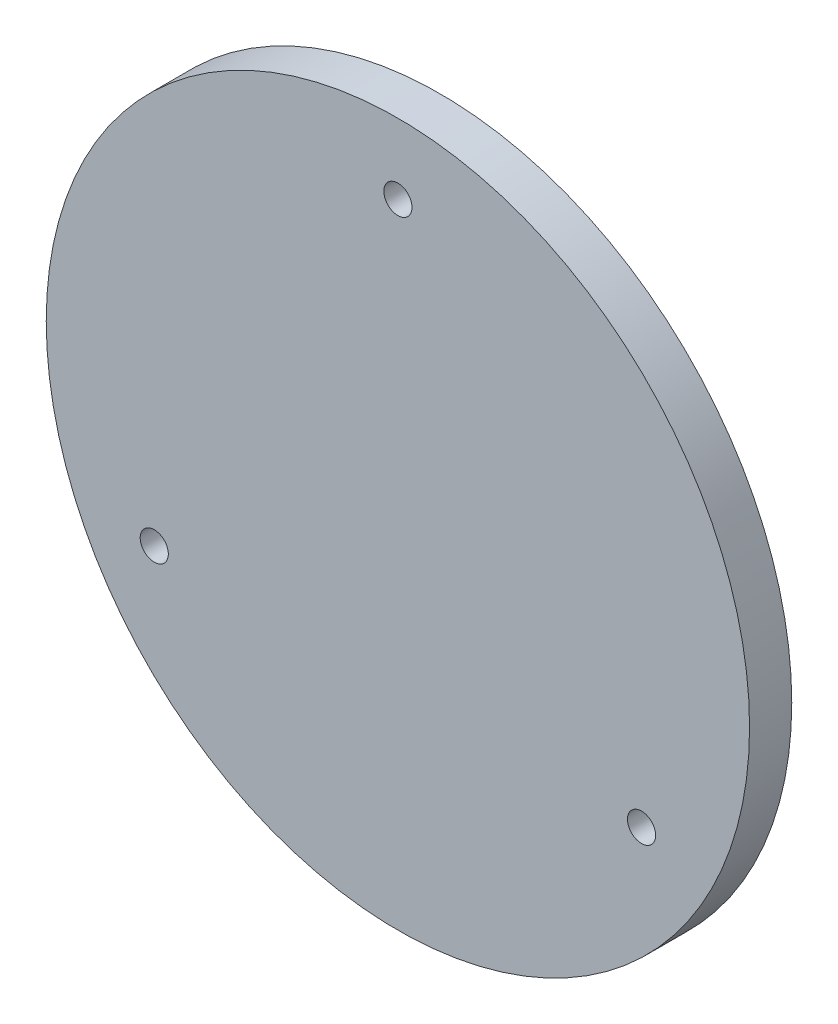
ISO-10303-21;
HEADER;
FILE_DESCRIPTION(('STEP AP214'),'2;1');
FILE_NAME('part.step','',(''),(''),'','','');
FILE_SCHEMA(('AUTOMOTIVE_DESIGN { 1 0 10303 214 1 1 1 1 }'));
ENDSEC;
DATA;
#1=APPLICATION_CONTEXT('core data for automotive mechanical design processes');
#2=APPLICATION_PROTOCOL_DEFINITION('international standard','automotive_design',2000,#1);
#3=PRODUCT_CONTEXT('',#1,'mechanical');
#4=PRODUCT('Part','Part','',(#3));
#5=PRODUCT_RELATED_PRODUCT_CATEGORY('part','',(#4));
#6=PRODUCT_DEFINITION_FORMATION('','',#4);
#7=PRODUCT_DEFINITION_CONTEXT('part definition',#1,'design');
#8=PRODUCT_DEFINITION('design','',#6,#7);
#9=PRODUCT_DEFINITION_SHAPE('','',#8);
#10=(LENGTH_UNIT() NAMED_UNIT(*) SI_UNIT(.MILLI.,.METRE.));
#11=(NAMED_UNIT(*) PLANE_ANGLE_UNIT() SI_UNIT($,.RADIAN.));
#12=(NAMED_UNIT(*) SI_UNIT($,.STERADIAN.) SOLID_ANGLE_UNIT());
#13=UNCERTAINTY_MEASURE_WITH_UNIT(LENGTH_MEASURE(1.E-05),#10,'distance_accuracy_value','');
#14=(GEOMETRIC_REPRESENTATION_CONTEXT(3) GLOBAL_UNCERTAINTY_ASSIGNED_CONTEXT((#13)) GLOBAL_UNIT_ASSIGNED_CONTEXT((#10,
#11,#12)) REPRESENTATION_CONTEXT('',''));
#15=CARTESIAN_POINT('',(0.,0.,0.));
#16=DIRECTION('',(0.,0.,1.));
#17=DIRECTION('',(1.,0.,0.));
#18=AXIS2_PLACEMENT_3D('',#15,#16,#17);
#19=CARTESIAN_POINT('',(0.,0.,3.));
#20=DIRECTION('',(0.,0.,1.));
#21=DIRECTION('',(1.,0.,0.));
#22=AXIS2_PLACEMENT_3D('',#19,#20,#21);
#23=PLANE('',#22);
#24=CARTESIAN_POINT('',(-17.3205080756887,-10.0000000000001,3.));
#25=DIRECTION('',(0.,0.,1.));
#26=DIRECTION('',(1.,0.,0.));
#27=AXIS2_PLACEMENT_3D('',#24,#25,#26);
#28=CIRCLE('',#27,1.);
#29=CARTESIAN_POINT('',(-16.3205080756887,-10.0000000000001,3.));
#30=VERTEX_POINT('',#29);
#31=EDGE_CURVE('E48',#30,#30,#28,.T.);
#32=ORIENTED_EDGE('',*,*,#31,.F.);
#33=EDGE_LOOP('',(#32));
#34=FACE_BOUND('',#33,.T.);
#35=CARTESIAN_POINT('',(0.,0.,3.));
#36=DIRECTION('',(0.,0.,1.));
#37=DIRECTION('',(1.,0.,0.));
#38=AXIS2_PLACEMENT_3D('',#35,#36,#37);
#39=CIRCLE('',#38,25.);
#40=CARTESIAN_POINT('',(25.,0.,3.));
#41=VERTEX_POINT('',#40);
#42=EDGE_CURVE('E10',#41,#41,#39,.T.);
#43=ORIENTED_EDGE('',*,*,#42,.T.);
#44=EDGE_LOOP('',(#43));
#45=FACE_BOUND('',#44,.T.);
#46=CARTESIAN_POINT('',(0.,20.,3.));
#47=DIRECTION('',(0.,0.,1.));
#48=DIRECTION('',(1.,0.,0.));
#49=AXIS2_PLACEMENT_3D('',#46,#47,#48);
#50=CIRCLE('',#49,1.);
#51=CARTESIAN_POINT('',(1.,20.,3.));
#52=VERTEX_POINT('',#51);
#53=EDGE_CURVE('E43',#52,#52,#50,.T.);
#54=ORIENTED_EDGE('',*,*,#53,.F.);
#55=EDGE_LOOP('',(#54));
#56=FACE_BOUND('',#55,.T.);
#57=CARTESIAN_POINT('',(17.3205080756887,-10.0000000000001,3.));
#58=DIRECTION('',(0.,0.,1.));
#59=DIRECTION('',(1.,0.,0.));
#60=AXIS2_PLACEMENT_3D('',#57,#58,#59);
#61=CIRCLE('',#60,1.);
#62=CARTESIAN_POINT('',(18.3205080756887,-10.0000000000001,3.));
#63=VERTEX_POINT('',#62);
#64=EDGE_CURVE('E54',#63,#63,#61,.T.);
#65=ORIENTED_EDGE('',*,*,#64,.F.);
#66=EDGE_LOOP('',(#65));
#67=FACE_BOUND('',#66,.T.);
#68=ADVANCED_FACE('F32',(#34,#45,#56,#67),#23,.T.);
#69=CARTESIAN_POINT('',(0.,0.,0.));
#70=DIRECTION('',(0.,0.,1.));
#71=DIRECTION('',(1.,0.,0.));
#72=AXIS2_PLACEMENT_3D('',#69,#70,#71);
#73=PLANE('',#72);
#74=CARTESIAN_POINT('',(0.,0.,0.));
#75=DIRECTION('',(0.,0.,1.));
#76=DIRECTION('',(1.,0.,0.));
#77=AXIS2_PLACEMENT_3D('',#74,#75,#76);
#78=CIRCLE('',#77,25.);
#79=CARTESIAN_POINT('',(25.,0.,0.));
#80=VERTEX_POINT('',#79);
#81=EDGE_CURVE('E36',#80,#80,#78,.T.);
#82=ORIENTED_EDGE('',*,*,#81,.F.);
#83=EDGE_LOOP('',(#82));
#84=FACE_BOUND('',#83,.T.);
#85=CARTESIAN_POINT('',(0.,20.,0.));
#86=DIRECTION('',(0.,0.,1.));
#87=DIRECTION('',(1.,0.,0.));
#88=AXIS2_PLACEMENT_3D('',#85,#86,#87);
#89=CIRCLE('',#88,1.);
#90=CARTESIAN_POINT('',(1.,20.,0.));
#91=VERTEX_POINT('',#90);
#92=EDGE_CURVE('E45',#91,#91,#89,.T.);
#93=ORIENTED_EDGE('',*,*,#92,.T.);
#94=EDGE_LOOP('',(#93));
#95=FACE_BOUND('',#94,.T.);
#96=CARTESIAN_POINT('',(-17.3205080756887,-10.0000000000001,0.));
#97=DIRECTION('',(0.,0.,1.));
#98=DIRECTION('',(1.,0.,0.));
#99=AXIS2_PLACEMENT_3D('',#96,#97,#98);
#100=CIRCLE('',#99,1.);
#101=CARTESIAN_POINT('',(-16.3205080756887,-10.0000000000001,0.));
#102=VERTEX_POINT('',#101);
#103=EDGE_CURVE('E51',#102,#102,#100,.T.);
#104=ORIENTED_EDGE('',*,*,#103,.T.);
#105=EDGE_LOOP('',(#104));
#106=FACE_BOUND('',#105,.T.);
#107=CARTESIAN_POINT('',(17.3205080756887,-10.0000000000001,0.));
#108=DIRECTION('',(0.,0.,1.));
#109=DIRECTION('',(1.,0.,0.));
#110=AXIS2_PLACEMENT_3D('',#107,#108,#109);
#111=CIRCLE('',#110,1.);
#112=CARTESIAN_POINT('',(18.3205080756887,-10.0000000000001,0.));
#113=VERTEX_POINT('',#112);
#114=EDGE_CURVE('E57',#113,#113,#111,.T.);
#115=ORIENTED_EDGE('',*,*,#114,.T.);
#116=EDGE_LOOP('',(#115));
#117=FACE_BOUND('',#116,.T.);
#118=ADVANCED_FACE('F67',(#84,#95,#106,#117),#73,.F.);
#119=CARTESIAN_POINT('',(0.,0.,3.));
#120=DIRECTION('',(0.,0.,-1.));
#121=DIRECTION('',(-1.,0.,0.));
#122=AXIS2_PLACEMENT_3D('',#119,#120,#121);
#123=CYLINDRICAL_SURFACE('',#122,25.);
#124=ORIENTED_EDGE('',*,*,#42,.F.);
#125=EDGE_LOOP('',(#124));
#126=FACE_BOUND('',#125,.T.);
#127=ORIENTED_EDGE('',*,*,#81,.T.);
#128=EDGE_LOOP('',(#127));
#129=FACE_BOUND('',#128,.T.);
#130=ADVANCED_FACE('F34',(#126,#129),#123,.T.);
#131=CARTESIAN_POINT('',(0.,20.,3.));
#132=DIRECTION('',(0.,0.,-1.));
#133=DIRECTION('',(-1.,0.,0.));
#134=AXIS2_PLACEMENT_3D('',#131,#132,#133);
#135=CYLINDRICAL_SURFACE('',#134,1.);
#136=ORIENTED_EDGE('',*,*,#53,.T.);
#137=EDGE_LOOP('',(#136));
#138=FACE_BOUND('',#137,.T.);
#139=ORIENTED_EDGE('',*,*,#92,.F.);
#140=EDGE_LOOP('',(#139));
#141=FACE_BOUND('',#140,.T.);
#142=ADVANCED_FACE('F76',(#138,#141),#135,.F.);
#143=CARTESIAN_POINT('',(-17.3205080756887,-10.0000000000001,3.));
#144=DIRECTION('',(0.,0.,-1.));
#145=DIRECTION('',(-1.,0.,0.));
#146=AXIS2_PLACEMENT_3D('',#143,#144,#145);
#147=CYLINDRICAL_SURFACE('',#146,1.);
#148=ORIENTED_EDGE('',*,*,#31,.T.);
#149=EDGE_LOOP('',(#148));
#150=FACE_BOUND('',#149,.T.);
#151=ORIENTED_EDGE('',*,*,#103,.F.);
#152=EDGE_LOOP('',(#151));
#153=FACE_BOUND('',#152,.T.);
#154=ADVANCED_FACE('F79',(#150,#153),#147,.F.);
#155=CARTESIAN_POINT('',(17.3205080756887,-10.0000000000001,3.));
#156=DIRECTION('',(0.,0.,-1.));
#157=DIRECTION('',(-1.,0.,0.));
#158=AXIS2_PLACEMENT_3D('',#155,#156,#157);
#159=CYLINDRICAL_SURFACE('',#158,1.);
#160=ORIENTED_EDGE('',*,*,#64,.T.);
#161=EDGE_LOOP('',(#160));
#162=FACE_BOUND('',#161,.T.);
#163=ORIENTED_EDGE('',*,*,#114,.F.);
#164=EDGE_LOOP('',(#163));
#165=FACE_BOUND('',#164,.T.);
#166=ADVANCED_FACE('F63',(#162,#165),#159,.F.);
#167=CLOSED_SHELL('',(#68,#118,#130,#142,#154,#166));
#168=MANIFOLD_SOLID_BREP('B2',#167);
#169=ADVANCED_BREP_SHAPE_REPRESENTATION('',(#18,#168),#14);
#170=SHAPE_DEFINITION_REPRESENTATION(#9,#169);
ENDSEC;
END-ISO-10303-21;
